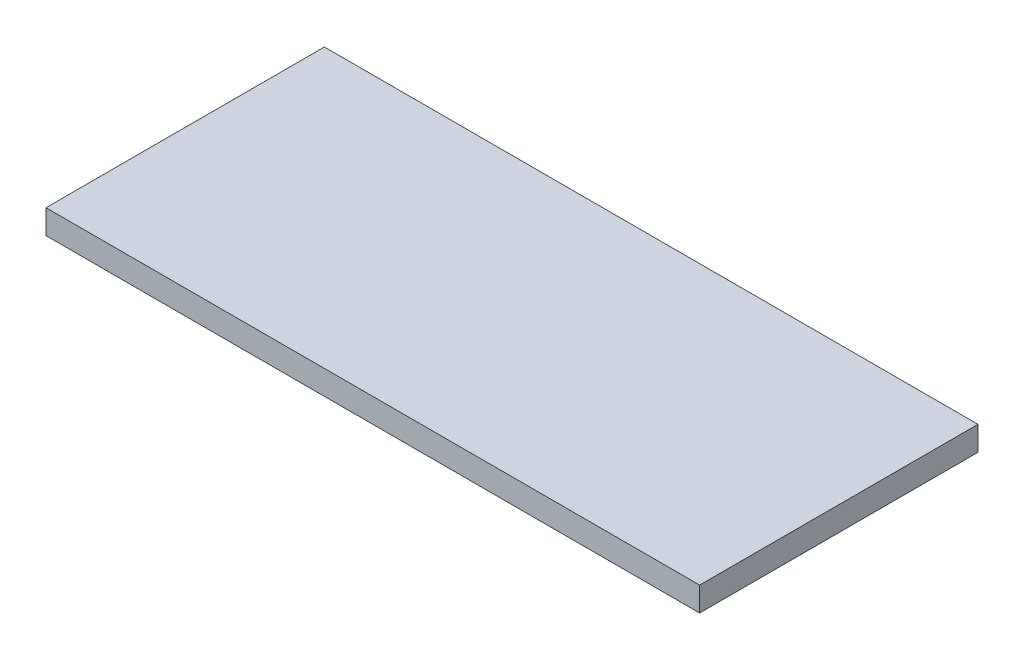
ISO-10303-21;
HEADER;
FILE_DESCRIPTION(('STEP AP214'),'2;1');
FILE_NAME('part.step','',(''),(''),'','','');
FILE_SCHEMA(('AUTOMOTIVE_DESIGN { 1 0 10303 214 1 1 1 1 }'));
ENDSEC;
DATA;
#1=APPLICATION_CONTEXT('core data for automotive mechanical design processes');
#2=APPLICATION_PROTOCOL_DEFINITION('international standard','automotive_design',2000,#1);
#3=PRODUCT_CONTEXT('',#1,'mechanical');
#4=PRODUCT('Part','Part','',(#3));
#5=PRODUCT_RELATED_PRODUCT_CATEGORY('part','',(#4));
#6=PRODUCT_DEFINITION_FORMATION('','',#4);
#7=PRODUCT_DEFINITION_CONTEXT('part definition',#1,'design');
#8=PRODUCT_DEFINITION('design','',#6,#7);
#9=PRODUCT_DEFINITION_SHAPE('','',#8);
#10=(LENGTH_UNIT() NAMED_UNIT(*) SI_UNIT(.MILLI.,.METRE.));
#11=(NAMED_UNIT(*) PLANE_ANGLE_UNIT() SI_UNIT($,.RADIAN.));
#12=(NAMED_UNIT(*) SI_UNIT($,.STERADIAN.) SOLID_ANGLE_UNIT());
#13=UNCERTAINTY_MEASURE_WITH_UNIT(LENGTH_MEASURE(1.E-05),#10,'distance_accuracy_value','');
#14=(GEOMETRIC_REPRESENTATION_CONTEXT(3) GLOBAL_UNCERTAINTY_ASSIGNED_CONTEXT((#13)) GLOBAL_UNIT_ASSIGNED_CONTEXT((#10,
#11,#12)) REPRESENTATION_CONTEXT('',''));
#15=CARTESIAN_POINT('',(0.,0.,0.));
#16=DIRECTION('',(0.,0.,1.));
#17=DIRECTION('',(1.,0.,0.));
#18=AXIS2_PLACEMENT_3D('',#15,#16,#17);
#19=CARTESIAN_POINT('',(27.,2.,11.5));
#20=DIRECTION('',(-1.,0.,0.));
#21=DIRECTION('',(0.,0.,1.));
#22=AXIS2_PLACEMENT_3D('',#19,#20,#21);
#23=PLANE('',#22);
#24=DIRECTION('',(0.,0.,-1.));
#25=VECTOR('',#24,1.);
#26=CARTESIAN_POINT('',(27.,0.,11.5));
#27=LINE('',#26,#25);
#28=CARTESIAN_POINT('',(27.,0.,11.5));
#29=VERTEX_POINT('',#28);
#30=CARTESIAN_POINT('',(27.,0.,-11.5));
#31=VERTEX_POINT('',#30);
#32=EDGE_CURVE('E96',#29,#31,#27,.T.);
#33=ORIENTED_EDGE('',*,*,#32,.T.);
#34=DIRECTION('',(0.,-1.,0.));
#35=VECTOR('',#34,1.);
#36=CARTESIAN_POINT('',(27.,2.,-11.5));
#37=LINE('',#36,#35);
#38=CARTESIAN_POINT('',(27.,2.,-11.5));
#39=VERTEX_POINT('',#38);
#40=EDGE_CURVE('E11',#39,#31,#37,.T.);
#41=ORIENTED_EDGE('',*,*,#40,.F.);
#42=DIRECTION('',(0.,0.,-1.));
#43=VECTOR('',#42,1.);
#44=CARTESIAN_POINT('',(27.,2.,11.5));
#45=LINE('',#44,#43);
#46=CARTESIAN_POINT('',(27.,2.,11.5));
#47=VERTEX_POINT('',#46);
#48=EDGE_CURVE('E84',#47,#39,#45,.T.);
#49=ORIENTED_EDGE('',*,*,#48,.F.);
#50=DIRECTION('',(0.,-1.,0.));
#51=VECTOR('',#50,1.);
#52=CARTESIAN_POINT('',(27.,2.,11.5));
#53=LINE('',#52,#51);
#54=EDGE_CURVE('E92',#47,#29,#53,.T.);
#55=ORIENTED_EDGE('',*,*,#54,.T.);
#56=EDGE_LOOP('',(#33,#41,#49,#55));
#57=FACE_BOUND('',#56,.T.);
#58=ADVANCED_FACE('F33',(#57),#23,.F.);
#59=CARTESIAN_POINT('',(-27.,2.,-11.5));
#60=DIRECTION('',(0.,0.,1.));
#61=DIRECTION('',(1.,0.,0.));
#62=AXIS2_PLACEMENT_3D('',#59,#60,#61);
#63=PLANE('',#62);
#64=DIRECTION('',(-1.,0.,0.));
#65=VECTOR('',#64,1.);
#66=CARTESIAN_POINT('',(-27.,0.,-11.5));
#67=LINE('',#66,#65);
#68=CARTESIAN_POINT('',(-27.,0.,-11.5));
#69=VERTEX_POINT('',#68);
#70=EDGE_CURVE('E88',#31,#69,#67,.T.);
#71=ORIENTED_EDGE('',*,*,#70,.T.);
#72=DIRECTION('',(0.,-1.,0.));
#73=VECTOR('',#72,1.);
#74=CARTESIAN_POINT('',(-27.,2.,-11.5));
#75=LINE('',#74,#73);
#76=CARTESIAN_POINT('',(-27.,2.,-11.5));
#77=VERTEX_POINT('',#76);
#78=EDGE_CURVE('E41',#77,#69,#75,.T.);
#79=ORIENTED_EDGE('',*,*,#78,.F.);
#80=DIRECTION('',(-1.,0.,0.));
#81=VECTOR('',#80,1.);
#82=CARTESIAN_POINT('',(-27.,2.,-11.5));
#83=LINE('',#82,#81);
#84=EDGE_CURVE('E79',#39,#77,#83,.T.);
#85=ORIENTED_EDGE('',*,*,#84,.F.);
#86=ORIENTED_EDGE('',*,*,#40,.T.);
#87=EDGE_LOOP('',(#71,#79,#85,#86));
#88=FACE_BOUND('',#87,.T.);
#89=ADVANCED_FACE('F87',(#88),#63,.F.);
#90=CARTESIAN_POINT('',(-27.,2.,11.5));
#91=DIRECTION('',(1.,0.,0.));
#92=DIRECTION('',(0.,0.,-1.));
#93=AXIS2_PLACEMENT_3D('',#90,#91,#92);
#94=PLANE('',#93);
#95=DIRECTION('',(0.,0.,1.));
#96=VECTOR('',#95,1.);
#97=CARTESIAN_POINT('',(-27.,0.,11.5));
#98=LINE('',#97,#96);
#99=CARTESIAN_POINT('',(-27.,0.,11.5));
#100=VERTEX_POINT('',#99);
#101=EDGE_CURVE('E66',#69,#100,#98,.T.);
#102=ORIENTED_EDGE('',*,*,#101,.T.);
#103=DIRECTION('',(0.,-1.,0.));
#104=VECTOR('',#103,1.);
#105=CARTESIAN_POINT('',(-27.,2.,11.5));
#106=LINE('',#105,#104);
#107=CARTESIAN_POINT('',(-27.,2.,11.5));
#108=VERTEX_POINT('',#107);
#109=EDGE_CURVE('E89',#108,#100,#106,.T.);
#110=ORIENTED_EDGE('',*,*,#109,.F.);
#111=DIRECTION('',(0.,0.,1.));
#112=VECTOR('',#111,1.);
#113=CARTESIAN_POINT('',(-27.,2.,11.5));
#114=LINE('',#113,#112);
#115=EDGE_CURVE('E82',#77,#108,#114,.T.);
#116=ORIENTED_EDGE('',*,*,#115,.F.);
#117=ORIENTED_EDGE('',*,*,#78,.T.);
#118=EDGE_LOOP('',(#102,#110,#116,#117));
#119=FACE_BOUND('',#118,.T.);
#120=ADVANCED_FACE('F90',(#119),#94,.F.);
#121=CARTESIAN_POINT('',(-27.,2.,11.5));
#122=DIRECTION('',(0.,0.,-1.));
#123=DIRECTION('',(-1.,0.,0.));
#124=AXIS2_PLACEMENT_3D('',#121,#122,#123);
#125=PLANE('',#124);
#126=DIRECTION('',(1.,0.,0.));
#127=VECTOR('',#126,1.);
#128=CARTESIAN_POINT('',(-27.,0.,11.5));
#129=LINE('',#128,#127);
#130=EDGE_CURVE('E72',#100,#29,#129,.T.);
#131=ORIENTED_EDGE('',*,*,#130,.T.);
#132=ORIENTED_EDGE('',*,*,#54,.F.);
#133=DIRECTION('',(1.,0.,0.));
#134=VECTOR('',#133,1.);
#135=CARTESIAN_POINT('',(-27.,2.,11.5));
#136=LINE('',#135,#134);
#137=EDGE_CURVE('E49',#108,#47,#136,.T.);
#138=ORIENTED_EDGE('',*,*,#137,.F.);
#139=ORIENTED_EDGE('',*,*,#109,.T.);
#140=EDGE_LOOP('',(#131,#132,#138,#139));
#141=FACE_BOUND('',#140,.T.);
#142=ADVANCED_FACE('F103',(#141),#125,.F.);
#143=CARTESIAN_POINT('',(0.,2.,0.));
#144=DIRECTION('',(0.,-1.,0.));
#145=DIRECTION('',(0.,0.,-1.));
#146=AXIS2_PLACEMENT_3D('',#143,#144,#145);
#147=PLANE('',#146);
#148=ORIENTED_EDGE('',*,*,#48,.T.);
#149=ORIENTED_EDGE('',*,*,#84,.T.);
#150=ORIENTED_EDGE('',*,*,#115,.T.);
#151=ORIENTED_EDGE('',*,*,#137,.T.);
#152=EDGE_LOOP('',(#148,#149,#150,#151));
#153=FACE_BOUND('',#152,.T.);
#154=ADVANCED_FACE('F80',(#153),#147,.F.);
#155=CARTESIAN_POINT('',(0.,0.,0.));
#156=DIRECTION('',(0.,-1.,0.));
#157=DIRECTION('',(0.,0.,-1.));
#158=AXIS2_PLACEMENT_3D('',#155,#156,#157);
#159=PLANE('',#158);
#160=ORIENTED_EDGE('',*,*,#32,.F.);
#161=ORIENTED_EDGE('',*,*,#130,.F.);
#162=ORIENTED_EDGE('',*,*,#101,.F.);
#163=ORIENTED_EDGE('',*,*,#70,.F.);
#164=EDGE_LOOP('',(#160,#161,#162,#163));
#165=FACE_BOUND('',#164,.T.);
#166=ADVANCED_FACE('F106',(#165),#159,.T.);
#167=CLOSED_SHELL('',(#58,#89,#120,#142,#154,#166));
#168=MANIFOLD_SOLID_BREP('B2',#167);
#169=ADVANCED_BREP_SHAPE_REPRESENTATION('',(#18,#168),#14);
#170=SHAPE_DEFINITION_REPRESENTATION(#9,#169);
ENDSEC;
END-ISO-10303-21;
